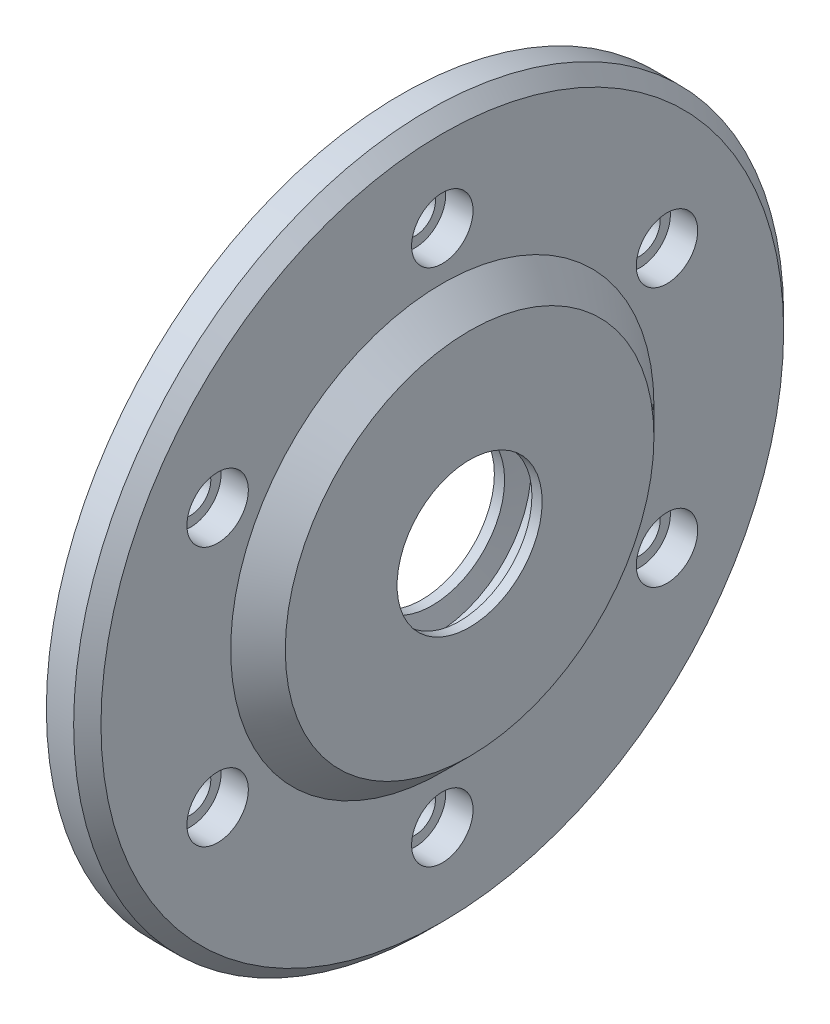
ISO-10303-21;
HEADER;
FILE_DESCRIPTION(('STEP AP214'),'2;1');
FILE_NAME('part.step','',(''),(''),'','','');
FILE_SCHEMA(('AUTOMOTIVE_DESIGN { 1 0 10303 214 1 1 1 1 }'));
ENDSEC;
DATA;
#1=APPLICATION_CONTEXT('core data for automotive mechanical design processes');
#2=APPLICATION_PROTOCOL_DEFINITION('international standard','automotive_design',2000,#1);
#3=PRODUCT_CONTEXT('',#1,'mechanical');
#4=PRODUCT('Part','Part','',(#3));
#5=PRODUCT_RELATED_PRODUCT_CATEGORY('part','',(#4));
#6=PRODUCT_DEFINITION_FORMATION('','',#4);
#7=PRODUCT_DEFINITION_CONTEXT('part definition',#1,'design');
#8=PRODUCT_DEFINITION('design','',#6,#7);
#9=PRODUCT_DEFINITION_SHAPE('','',#8);
#10=(LENGTH_UNIT() NAMED_UNIT(*) SI_UNIT(.MILLI.,.METRE.));
#11=(NAMED_UNIT(*) PLANE_ANGLE_UNIT() SI_UNIT($,.RADIAN.));
#12=(NAMED_UNIT(*) SI_UNIT($,.STERADIAN.) SOLID_ANGLE_UNIT());
#13=UNCERTAINTY_MEASURE_WITH_UNIT(LENGTH_MEASURE(1.E-05),#10,'distance_accuracy_value','');
#14=(GEOMETRIC_REPRESENTATION_CONTEXT(3) GLOBAL_UNCERTAINTY_ASSIGNED_CONTEXT((#13)) GLOBAL_UNIT_ASSIGNED_CONTEXT((#10,
#11,#12)) REPRESENTATION_CONTEXT('',''));
#15=CARTESIAN_POINT('',(0.,0.,0.));
#16=DIRECTION('',(0.,0.,1.));
#17=DIRECTION('',(1.,0.,0.));
#18=AXIS2_PLACEMENT_3D('',#15,#16,#17);
#19=CARTESIAN_POINT('',(0.,0.,0.));
#20=DIRECTION('',(1.,0.,0.));
#21=DIRECTION('',(0.,0.,-1.));
#22=AXIS2_PLACEMENT_3D('',#19,#20,#21);
#23=CYLINDRICAL_SURFACE('',#22,52.);
#24=CARTESIAN_POINT('',(3.9999999999996,0.,0.));
#25=DIRECTION('',(1.,0.,0.));
#26=DIRECTION('',(0.,0.,-1.));
#27=AXIS2_PLACEMENT_3D('',#24,#25,#26);
#28=CIRCLE('',#27,52.);
#29=CARTESIAN_POINT('',(3.9999999999996,0.,-52.));
#30=VERTEX_POINT('',#29);
#31=EDGE_CURVE('E10',#30,#30,#28,.F.);
#32=ORIENTED_EDGE('',*,*,#31,.T.);
#33=EDGE_LOOP('',(#32));
#34=FACE_BOUND('',#33,.T.);
#35=CARTESIAN_POINT('',(0.,0.,0.));
#36=DIRECTION('',(1.,0.,0.));
#37=DIRECTION('',(0.,0.,-1.));
#38=AXIS2_PLACEMENT_3D('',#35,#36,#37);
#39=CIRCLE('',#38,52.);
#40=CARTESIAN_POINT('',(0.,0.,-52.));
#41=VERTEX_POINT('',#40);
#42=EDGE_CURVE('E42',#41,#41,#39,.T.);
#43=ORIENTED_EDGE('',*,*,#42,.T.);
#44=EDGE_LOOP('',(#43));
#45=FACE_BOUND('',#44,.T.);
#46=ADVANCED_FACE('F31',(#34,#45),#23,.T.);
#47=CARTESIAN_POINT('',(0.,52.,0.));
#48=DIRECTION('',(-1.,0.,0.));
#49=DIRECTION('',(0.,0.,1.));
#50=AXIS2_PLACEMENT_3D('',#47,#48,#49);
#51=PLANE('',#50);
#52=CARTESIAN_POINT('',(0.,-19.,-32.9089653438087));
#53=DIRECTION('',(-1.,0.,0.));
#54=DIRECTION('',(0.,0.,1.));
#55=AXIS2_PLACEMENT_3D('',#52,#53,#54);
#56=CIRCLE('',#55,3.00000000000001);
#57=CARTESIAN_POINT('',(0.,-19.,-29.9089653438087));
#58=VERTEX_POINT('',#57);
#59=EDGE_CURVE('E49',#58,#58,#56,.T.);
#60=ORIENTED_EDGE('',*,*,#59,.F.);
#61=EDGE_LOOP('',(#60));
#62=FACE_BOUND('',#61,.T.);
#63=CARTESIAN_POINT('',(0.,-38.,0.));
#64=DIRECTION('',(-1.,0.,0.));
#65=DIRECTION('',(0.,0.,1.));
#66=AXIS2_PLACEMENT_3D('',#63,#64,#65);
#67=CIRCLE('',#66,3.00000000000002);
#68=CARTESIAN_POINT('',(0.,-38.,3.00000000000002));
#69=VERTEX_POINT('',#68);
#70=EDGE_CURVE('E54',#69,#69,#67,.T.);
#71=ORIENTED_EDGE('',*,*,#70,.F.);
#72=EDGE_LOOP('',(#71));
#73=FACE_BOUND('',#72,.T.);
#74=CARTESIAN_POINT('',(0.,-19.,32.9089653438087));
#75=DIRECTION('',(-1.,0.,0.));
#76=DIRECTION('',(0.,0.,1.));
#77=AXIS2_PLACEMENT_3D('',#74,#75,#76);
#78=CIRCLE('',#77,3.00000000000001);
#79=CARTESIAN_POINT('',(0.,-19.,35.9089653438087));
#80=VERTEX_POINT('',#79);
#81=EDGE_CURVE('E59',#80,#80,#78,.T.);
#82=ORIENTED_EDGE('',*,*,#81,.F.);
#83=EDGE_LOOP('',(#82));
#84=FACE_BOUND('',#83,.T.);
#85=CARTESIAN_POINT('',(0.,19.,32.9089653438087));
#86=DIRECTION('',(-1.,0.,0.));
#87=DIRECTION('',(0.,0.,1.));
#88=AXIS2_PLACEMENT_3D('',#85,#86,#87);
#89=CIRCLE('',#88,3.00000000000001);
#90=CARTESIAN_POINT('',(0.,19.,35.9089653438087));
#91=VERTEX_POINT('',#90);
#92=EDGE_CURVE('E64',#91,#91,#89,.T.);
#93=ORIENTED_EDGE('',*,*,#92,.F.);
#94=EDGE_LOOP('',(#93));
#95=FACE_BOUND('',#94,.T.);
#96=CARTESIAN_POINT('',(0.,38.,0.));
#97=DIRECTION('',(-1.,0.,0.));
#98=DIRECTION('',(0.,0.,1.));
#99=AXIS2_PLACEMENT_3D('',#96,#97,#98);
#100=CIRCLE('',#99,3.00000000000002);
#101=CARTESIAN_POINT('',(0.,38.,3.00000000000001));
#102=VERTEX_POINT('',#101);
#103=EDGE_CURVE('E69',#102,#102,#100,.T.);
#104=ORIENTED_EDGE('',*,*,#103,.F.);
#105=EDGE_LOOP('',(#104));
#106=FACE_BOUND('',#105,.T.);
#107=CARTESIAN_POINT('',(0.,19.,-32.9089653438087));
#108=DIRECTION('',(-1.,0.,0.));
#109=DIRECTION('',(0.,0.,1.));
#110=AXIS2_PLACEMENT_3D('',#107,#108,#109);
#111=CIRCLE('',#110,3.00000000000001);
#112=CARTESIAN_POINT('',(0.,19.,-29.9089653438087));
#113=VERTEX_POINT('',#112);
#114=EDGE_CURVE('E74',#113,#113,#111,.T.);
#115=ORIENTED_EDGE('',*,*,#114,.F.);
#116=EDGE_LOOP('',(#115));
#117=FACE_BOUND('',#116,.T.);
#118=CARTESIAN_POINT('',(0.,0.,0.));
#119=DIRECTION('',(-1.,0.,0.));
#120=DIRECTION('',(0.,0.,1.));
#121=AXIS2_PLACEMENT_3D('',#118,#119,#120);
#122=CIRCLE('',#121,33.);
#123=CARTESIAN_POINT('',(0.,0.,33.));
#124=VERTEX_POINT('',#123);
#125=EDGE_CURVE('E85',#124,#124,#122,.T.);
#126=ORIENTED_EDGE('',*,*,#125,.F.);
#127=EDGE_LOOP('',(#126));
#128=FACE_BOUND('',#127,.T.);
#129=ORIENTED_EDGE('',*,*,#42,.F.);
#130=EDGE_LOOP('',(#129));
#131=FACE_BOUND('',#130,.T.);
#132=ADVANCED_FACE('F169',(#62,#73,#84,#95,#106,#117,#128,#131),#51,.T.);
#133=CARTESIAN_POINT('',(6.,0.,0.));
#134=DIRECTION('',(1.,0.,0.));
#135=DIRECTION('',(0.,0.,-1.));
#136=AXIS2_PLACEMENT_3D('',#133,#134,#135);
#137=PLANE('',#136);
#138=CARTESIAN_POINT('',(6.,0.,0.));
#139=DIRECTION('',(1.,0.,0.));
#140=DIRECTION('',(0.,0.,-1.));
#141=AXIS2_PLACEMENT_3D('',#138,#139,#140);
#142=CIRCLE('',#141,49.9999999999996);
#143=CARTESIAN_POINT('',(6.,0.,-49.9999999999996));
#144=VERTEX_POINT('',#143);
#145=EDGE_CURVE('E38',#144,#144,#142,.T.);
#146=ORIENTED_EDGE('',*,*,#145,.T.);
#147=EDGE_LOOP('',(#146));
#148=FACE_BOUND('',#147,.T.);
#149=CARTESIAN_POINT('',(6.,-19.,-32.9089653438087));
#150=DIRECTION('',(1.,0.,0.));
#151=DIRECTION('',(0.,0.,-1.));
#152=AXIS2_PLACEMENT_3D('',#149,#150,#151);
#153=CIRCLE('',#152,4.50000000000001);
#154=CARTESIAN_POINT('',(6.,-19.,-37.4089653438087));
#155=VERTEX_POINT('',#154);
#156=EDGE_CURVE('E159',#155,#155,#153,.T.);
#157=ORIENTED_EDGE('',*,*,#156,.F.);
#158=EDGE_LOOP('',(#157));
#159=FACE_BOUND('',#158,.T.);
#160=CARTESIAN_POINT('',(6.,-38.,0.));
#161=DIRECTION('',(1.,0.,0.));
#162=DIRECTION('',(0.,0.,-1.));
#163=AXIS2_PLACEMENT_3D('',#160,#161,#162);
#164=CIRCLE('',#163,4.50000000000001);
#165=CARTESIAN_POINT('',(6.,-38.,-4.50000000000001));
#166=VERTEX_POINT('',#165);
#167=EDGE_CURVE('E52',#166,#166,#164,.T.);
#168=ORIENTED_EDGE('',*,*,#167,.F.);
#169=EDGE_LOOP('',(#168));
#170=FACE_BOUND('',#169,.T.);
#171=CARTESIAN_POINT('',(6.,-19.,32.9089653438087));
#172=DIRECTION('',(1.,0.,0.));
#173=DIRECTION('',(0.,0.,-1.));
#174=AXIS2_PLACEMENT_3D('',#171,#172,#173);
#175=CIRCLE('',#174,4.50000000000001);
#176=CARTESIAN_POINT('',(6.,-19.,28.4089653438087));
#177=VERTEX_POINT('',#176);
#178=EDGE_CURVE('E57',#177,#177,#175,.T.);
#179=ORIENTED_EDGE('',*,*,#178,.F.);
#180=EDGE_LOOP('',(#179));
#181=FACE_BOUND('',#180,.T.);
#182=CARTESIAN_POINT('',(6.,19.,32.9089653438087));
#183=DIRECTION('',(1.,0.,0.));
#184=DIRECTION('',(0.,0.,-1.));
#185=AXIS2_PLACEMENT_3D('',#182,#183,#184);
#186=CIRCLE('',#185,4.50000000000001);
#187=CARTESIAN_POINT('',(6.,19.,28.4089653438087));
#188=VERTEX_POINT('',#187);
#189=EDGE_CURVE('E62',#188,#188,#186,.T.);
#190=ORIENTED_EDGE('',*,*,#189,.F.);
#191=EDGE_LOOP('',(#190));
#192=FACE_BOUND('',#191,.T.);
#193=CARTESIAN_POINT('',(6.,38.,0.));
#194=DIRECTION('',(1.,0.,0.));
#195=DIRECTION('',(0.,0.,-1.));
#196=AXIS2_PLACEMENT_3D('',#193,#194,#195);
#197=CIRCLE('',#196,4.50000000000001);
#198=CARTESIAN_POINT('',(6.,38.,-4.50000000000002));
#199=VERTEX_POINT('',#198);
#200=EDGE_CURVE('E67',#199,#199,#197,.T.);
#201=ORIENTED_EDGE('',*,*,#200,.F.);
#202=EDGE_LOOP('',(#201));
#203=FACE_BOUND('',#202,.T.);
#204=CARTESIAN_POINT('',(6.,19.,-32.9089653438087));
#205=DIRECTION('',(1.,0.,0.));
#206=DIRECTION('',(0.,0.,-1.));
#207=AXIS2_PLACEMENT_3D('',#204,#205,#206);
#208=CIRCLE('',#207,4.50000000000001);
#209=CARTESIAN_POINT('',(6.,19.,-37.4089653438087));
#210=VERTEX_POINT('',#209);
#211=EDGE_CURVE('E72',#210,#210,#208,.T.);
#212=ORIENTED_EDGE('',*,*,#211,.F.);
#213=EDGE_LOOP('',(#212));
#214=FACE_BOUND('',#213,.T.);
#215=CARTESIAN_POINT('',(6.,0.,0.));
#216=DIRECTION('',(1.,0.,0.));
#217=DIRECTION('',(0.,0.,-1.));
#218=AXIS2_PLACEMENT_3D('',#215,#216,#217);
#219=CIRCLE('',#218,31.);
#220=CARTESIAN_POINT('',(6.,0.,-31.));
#221=VERTEX_POINT('',#220);
#222=EDGE_CURVE('E81',#221,#221,#219,.T.);
#223=ORIENTED_EDGE('',*,*,#222,.F.);
#224=EDGE_LOOP('',(#223));
#225=FACE_BOUND('',#224,.T.);
#226=ADVANCED_FACE('F165',(#148,#159,#170,#181,#192,#203,#214,#225),#137,.T.);
#227=CARTESIAN_POINT('',(6.,0.,0.));
#228=DIRECTION('',(-1.,0.,0.));
#229=DIRECTION('',(0.,0.,-1.));
#230=AXIS2_PLACEMENT_3D('',#227,#228,#229);
#231=CONICAL_SURFACE('',#230,31.,0.785398163397445);
#232=CARTESIAN_POINT('',(10.,0.,0.));
#233=DIRECTION('',(1.,0.,0.));
#234=DIRECTION('',(0.,0.,-1.));
#235=AXIS2_PLACEMENT_3D('',#232,#233,#234);
#236=CIRCLE('',#235,27.);
#237=CARTESIAN_POINT('',(10.,0.,-27.));
#238=VERTEX_POINT('',#237);
#239=EDGE_CURVE('E46',#238,#238,#236,.T.);
#240=ORIENTED_EDGE('',*,*,#239,.F.);
#241=EDGE_LOOP('',(#240));
#242=FACE_BOUND('',#241,.T.);
#243=ORIENTED_EDGE('',*,*,#222,.T.);
#244=EDGE_LOOP('',(#243));
#245=FACE_BOUND('',#244,.T.);
#246=ADVANCED_FACE('F168',(#242,#245),#231,.T.);
#247=CARTESIAN_POINT('',(10.,0.,0.));
#248=DIRECTION('',(1.,0.,0.));
#249=DIRECTION('',(0.,0.,-1.));
#250=AXIS2_PLACEMENT_3D('',#247,#248,#249);
#251=PLANE('',#250);
#252=CARTESIAN_POINT('',(10.,0.,0.));
#253=DIRECTION('',(1.,0.,0.));
#254=DIRECTION('',(0.,0.,-1.));
#255=AXIS2_PLACEMENT_3D('',#252,#253,#254);
#256=CIRCLE('',#255,10.6264091280305);
#257=CARTESIAN_POINT('',(10.,0.,-10.6264091280305));
#258=VERTEX_POINT('',#257);
#259=EDGE_CURVE('E93',#258,#258,#256,.T.);
#260=ORIENTED_EDGE('',*,*,#259,.F.);
#261=EDGE_LOOP('',(#260));
#262=FACE_BOUND('',#261,.T.);
#263=ORIENTED_EDGE('',*,*,#239,.T.);
#264=EDGE_LOOP('',(#263));
#265=FACE_BOUND('',#264,.T.);
#266=ADVANCED_FACE('F184',(#262,#265),#251,.T.);
#267=CARTESIAN_POINT('',(-1.,0.,0.));
#268=DIRECTION('',(1.,0.,0.));
#269=DIRECTION('',(0.,0.,-1.));
#270=AXIS2_PLACEMENT_3D('',#267,#268,#269);
#271=CYLINDRICAL_SURFACE('',#270,33.);
#272=CARTESIAN_POINT('',(-1.,0.,0.));
#273=DIRECTION('',(-1.,0.,0.));
#274=DIRECTION('',(0.,0.,1.));
#275=AXIS2_PLACEMENT_3D('',#272,#273,#274);
#276=CIRCLE('',#275,33.);
#277=CARTESIAN_POINT('',(-1.,0.,33.));
#278=VERTEX_POINT('',#277);
#279=EDGE_CURVE('E84',#278,#278,#276,.T.);
#280=ORIENTED_EDGE('',*,*,#279,.F.);
#281=EDGE_LOOP('',(#280));
#282=FACE_BOUND('',#281,.T.);
#283=ORIENTED_EDGE('',*,*,#125,.T.);
#284=EDGE_LOOP('',(#283));
#285=FACE_BOUND('',#284,.T.);
#286=ADVANCED_FACE('F190',(#282,#285),#271,.T.);
#287=CARTESIAN_POINT('',(-1.,0.,0.));
#288=DIRECTION('',(-1.,0.,0.));
#289=DIRECTION('',(0.,0.,1.));
#290=AXIS2_PLACEMENT_3D('',#287,#288,#289);
#291=PLANE('',#290);
#292=CARTESIAN_POINT('',(-1.,0.,0.));
#293=DIRECTION('',(1.,0.,0.));
#294=DIRECTION('',(0.,0.,-1.));
#295=AXIS2_PLACEMENT_3D('',#292,#293,#294);
#296=CIRCLE('',#295,25.);
#297=CARTESIAN_POINT('',(-1.,0.,-25.));
#298=VERTEX_POINT('',#297);
#299=EDGE_CURVE('E88',#298,#298,#296,.T.);
#300=ORIENTED_EDGE('',*,*,#299,.T.);
#301=EDGE_LOOP('',(#300));
#302=FACE_BOUND('',#301,.T.);
#303=ORIENTED_EDGE('',*,*,#279,.T.);
#304=EDGE_LOOP('',(#303));
#305=FACE_BOUND('',#304,.T.);
#306=ADVANCED_FACE('F220',(#302,#305),#291,.T.);
#307=CARTESIAN_POINT('',(-1.,0.,0.));
#308=DIRECTION('',(1.,0.,0.));
#309=DIRECTION('',(0.,0.,-1.));
#310=AXIS2_PLACEMENT_3D('',#307,#308,#309);
#311=CYLINDRICAL_SURFACE('',#310,25.);
#312=ORIENTED_EDGE('',*,*,#299,.F.);
#313=EDGE_LOOP('',(#312));
#314=FACE_BOUND('',#313,.T.);
#315=CARTESIAN_POINT('',(0.,0.,0.));
#316=DIRECTION('',(1.,0.,0.));
#317=DIRECTION('',(0.,0.,-1.));
#318=AXIS2_PLACEMENT_3D('',#315,#316,#317);
#319=CIRCLE('',#318,25.);
#320=CARTESIAN_POINT('',(0.,0.,-25.));
#321=VERTEX_POINT('',#320);
#322=EDGE_CURVE('E76',#321,#321,#319,.T.);
#323=ORIENTED_EDGE('',*,*,#322,.T.);
#324=EDGE_LOOP('',(#323));
#325=FACE_BOUND('',#324,.T.);
#326=ADVANCED_FACE('F226',(#314,#325),#311,.F.);
#327=CARTESIAN_POINT('',(-1.,0.,0.));
#328=DIRECTION('',(1.,0.,0.));
#329=DIRECTION('',(0.,0.,-1.));
#330=AXIS2_PLACEMENT_3D('',#327,#328,#329);
#331=CYLINDRICAL_SURFACE('',#330,10.6264091280305);
#332=CARTESIAN_POINT('',(8.5,0.,0.));
#333=DIRECTION('',(1.,0.,0.));
#334=DIRECTION('',(0.,0.,-1.));
#335=AXIS2_PLACEMENT_3D('',#332,#333,#334);
#336=CIRCLE('',#335,10.6264091280305);
#337=CARTESIAN_POINT('',(8.5,0.,-10.6264091280305));
#338=VERTEX_POINT('',#337);
#339=EDGE_CURVE('E96',#338,#338,#336,.T.);
#340=ORIENTED_EDGE('',*,*,#339,.F.);
#341=EDGE_LOOP('',(#340));
#342=FACE_BOUND('',#341,.T.);
#343=ORIENTED_EDGE('',*,*,#259,.T.);
#344=EDGE_LOOP('',(#343));
#345=FACE_BOUND('',#344,.T.);
#346=ADVANCED_FACE('F233',(#342,#345),#331,.F.);
#347=CARTESIAN_POINT('',(8.5,0.,0.));
#348=DIRECTION('',(-1.,0.,0.));
#349=DIRECTION('',(0.,0.,1.));
#350=AXIS2_PLACEMENT_3D('',#347,#348,#349);
#351=CONICAL_SURFACE('',#350,10.6264091280305,1.42365742036362);
#352=CARTESIAN_POINT('',(7.99999999999999,0.,0.));
#353=DIRECTION('',(1.,0.,0.));
#354=DIRECTION('',(0.,0.,-1.));
#355=AXIS2_PLACEMENT_3D('',#352,#353,#354);
#356=CIRCLE('',#355,14.);
#357=CARTESIAN_POINT('',(7.99999999999999,0.,-14.));
#358=VERTEX_POINT('',#357);
#359=EDGE_CURVE('E99',#358,#358,#356,.T.);
#360=ORIENTED_EDGE('',*,*,#359,.F.);
#361=EDGE_LOOP('',(#360));
#362=FACE_BOUND('',#361,.T.);
#363=ORIENTED_EDGE('',*,*,#339,.T.);
#364=EDGE_LOOP('',(#363));
#365=FACE_BOUND('',#364,.T.);
#366=ADVANCED_FACE('F237',(#362,#365),#351,.F.);
#367=CARTESIAN_POINT('',(-1.,0.,0.));
#368=DIRECTION('',(1.,0.,0.));
#369=DIRECTION('',(0.,0.,-1.));
#370=AXIS2_PLACEMENT_3D('',#367,#368,#369);
#371=CYLINDRICAL_SURFACE('',#370,14.);
#372=CARTESIAN_POINT('',(5.,0.,0.));
#373=DIRECTION('',(1.,0.,0.));
#374=DIRECTION('',(0.,0.,-1.));
#375=AXIS2_PLACEMENT_3D('',#372,#373,#374);
#376=CIRCLE('',#375,14.);
#377=CARTESIAN_POINT('',(5.,0.,-14.));
#378=VERTEX_POINT('',#377);
#379=EDGE_CURVE('E102',#378,#378,#376,.T.);
#380=ORIENTED_EDGE('',*,*,#379,.F.);
#381=EDGE_LOOP('',(#380));
#382=FACE_BOUND('',#381,.T.);
#383=ORIENTED_EDGE('',*,*,#359,.T.);
#384=EDGE_LOOP('',(#383));
#385=FACE_BOUND('',#384,.T.);
#386=ADVANCED_FACE('F241',(#382,#385),#371,.F.);
#387=CARTESIAN_POINT('',(5.,0.,0.));
#388=DIRECTION('',(1.,0.,0.));
#389=DIRECTION('',(0.,0.,-1.));
#390=AXIS2_PLACEMENT_3D('',#387,#388,#389);
#391=CONICAL_SURFACE('',#390,14.,1.42365742036362);
#392=CARTESIAN_POINT('',(4.5,0.,0.));
#393=DIRECTION('',(1.,0.,0.));
#394=DIRECTION('',(0.,0.,-1.));
#395=AXIS2_PLACEMENT_3D('',#392,#393,#394);
#396=CIRCLE('',#395,10.6264091280305);
#397=CARTESIAN_POINT('',(4.5,0.,-10.6264091280305));
#398=VERTEX_POINT('',#397);
#399=EDGE_CURVE('E105',#398,#398,#396,.T.);
#400=ORIENTED_EDGE('',*,*,#399,.F.);
#401=EDGE_LOOP('',(#400));
#402=FACE_BOUND('',#401,.T.);
#403=ORIENTED_EDGE('',*,*,#379,.T.);
#404=EDGE_LOOP('',(#403));
#405=FACE_BOUND('',#404,.T.);
#406=ADVANCED_FACE('F245',(#402,#405),#391,.F.);
#407=CARTESIAN_POINT('',(-1.,0.,0.));
#408=DIRECTION('',(1.,0.,0.));
#409=DIRECTION('',(0.,0.,-1.));
#410=AXIS2_PLACEMENT_3D('',#407,#408,#409);
#411=CYLINDRICAL_SURFACE('',#410,10.6264091280305);
#412=CARTESIAN_POINT('',(3.,0.,0.));
#413=DIRECTION('',(1.,0.,0.));
#414=DIRECTION('',(0.,0.,-1.));
#415=AXIS2_PLACEMENT_3D('',#412,#413,#414);
#416=CIRCLE('',#415,10.6264091280305);
#417=CARTESIAN_POINT('',(3.,0.,-10.6264091280305));
#418=VERTEX_POINT('',#417);
#419=EDGE_CURVE('E108',#418,#418,#416,.T.);
#420=ORIENTED_EDGE('',*,*,#419,.F.);
#421=EDGE_LOOP('',(#420));
#422=FACE_BOUND('',#421,.T.);
#423=ORIENTED_EDGE('',*,*,#399,.T.);
#424=EDGE_LOOP('',(#423));
#425=FACE_BOUND('',#424,.T.);
#426=ADVANCED_FACE('F249',(#422,#425),#411,.F.);
#427=CARTESIAN_POINT('',(3.,10.6264091280305,0.));
#428=DIRECTION('',(1.,0.,0.));
#429=DIRECTION('',(0.,0.,-1.));
#430=AXIS2_PLACEMENT_3D('',#427,#428,#429);
#431=PLANE('',#430);
#432=CARTESIAN_POINT('',(3.,0.,0.));
#433=DIRECTION('',(1.,0.,0.));
#434=DIRECTION('',(0.,0.,-1.));
#435=AXIS2_PLACEMENT_3D('',#432,#433,#434);
#436=CIRCLE('',#435,18.);
#437=CARTESIAN_POINT('',(3.,0.,-18.));
#438=VERTEX_POINT('',#437);
#439=EDGE_CURVE('E111',#438,#438,#436,.T.);
#440=ORIENTED_EDGE('',*,*,#439,.F.);
#441=EDGE_LOOP('',(#440));
#442=FACE_BOUND('',#441,.T.);
#443=ORIENTED_EDGE('',*,*,#419,.T.);
#444=EDGE_LOOP('',(#443));
#445=FACE_BOUND('',#444,.T.);
#446=ADVANCED_FACE('F253',(#442,#445),#431,.F.);
#447=CARTESIAN_POINT('',(-1.,0.,0.));
#448=DIRECTION('',(1.,0.,0.));
#449=DIRECTION('',(0.,0.,-1.));
#450=AXIS2_PLACEMENT_3D('',#447,#448,#449);
#451=CYLINDRICAL_SURFACE('',#450,18.);
#452=CARTESIAN_POINT('',(0.,0.,0.));
#453=DIRECTION('',(1.,0.,0.));
#454=DIRECTION('',(0.,0.,-1.));
#455=AXIS2_PLACEMENT_3D('',#452,#453,#454);
#456=CIRCLE('',#455,18.);
#457=CARTESIAN_POINT('',(0.,0.,-18.));
#458=VERTEX_POINT('',#457);
#459=EDGE_CURVE('E114',#458,#458,#456,.T.);
#460=ORIENTED_EDGE('',*,*,#459,.F.);
#461=EDGE_LOOP('',(#460));
#462=FACE_BOUND('',#461,.T.);
#463=ORIENTED_EDGE('',*,*,#439,.T.);
#464=EDGE_LOOP('',(#463));
#465=FACE_BOUND('',#464,.T.);
#466=ADVANCED_FACE('F257',(#462,#465),#451,.F.);
#467=CARTESIAN_POINT('',(0.,18.,0.));
#468=DIRECTION('',(1.,0.,0.));
#469=DIRECTION('',(0.,0.,-1.));
#470=AXIS2_PLACEMENT_3D('',#467,#468,#469);
#471=PLANE('',#470);
#472=ORIENTED_EDGE('',*,*,#322,.F.);
#473=EDGE_LOOP('',(#472));
#474=FACE_BOUND('',#473,.T.);
#475=ORIENTED_EDGE('',*,*,#459,.T.);
#476=EDGE_LOOP('',(#475));
#477=FACE_BOUND('',#476,.T.);
#478=ADVANCED_FACE('F261',(#474,#477),#471,.F.);
#479=CARTESIAN_POINT('',(6.,19.,-32.9089653438087));
#480=DIRECTION('',(1.,0.,0.));
#481=DIRECTION('',(0.,0.,-1.));
#482=AXIS2_PLACEMENT_3D('',#479,#480,#481);
#483=CYLINDRICAL_SURFACE('',#482,3.00000000000001);
#484=ORIENTED_EDGE('',*,*,#114,.T.);
#485=EDGE_LOOP('',(#484));
#486=FACE_BOUND('',#485,.T.);
#487=CARTESIAN_POINT('',(2.,19.,-32.9089653438087));
#488=DIRECTION('',(1.,0.,0.));
#489=DIRECTION('',(0.,0.,-1.));
#490=AXIS2_PLACEMENT_3D('',#487,#488,#489);
#491=CIRCLE('',#490,3.00000000000001);
#492=CARTESIAN_POINT('',(2.,19.,-35.9089653438087));
#493=VERTEX_POINT('',#492);
#494=EDGE_CURVE('E77',#493,#493,#491,.T.);
#495=ORIENTED_EDGE('',*,*,#494,.T.);
#496=EDGE_LOOP('',(#495));
#497=FACE_BOUND('',#496,.T.);
#498=ADVANCED_FACE('F265',(#486,#497),#483,.F.);
#499=CARTESIAN_POINT('',(2.,22.,-32.9089653438087));
#500=DIRECTION('',(-1.,0.,0.));
#501=DIRECTION('',(0.,0.,1.));
#502=AXIS2_PLACEMENT_3D('',#499,#500,#501);
#503=PLANE('',#502);
#504=ORIENTED_EDGE('',*,*,#494,.F.);
#505=EDGE_LOOP('',(#504));
#506=FACE_BOUND('',#505,.T.);
#507=CARTESIAN_POINT('',(2.,19.,-32.9089653438087));
#508=DIRECTION('',(1.,0.,0.));
#509=DIRECTION('',(0.,0.,-1.));
#510=AXIS2_PLACEMENT_3D('',#507,#508,#509);
#511=CIRCLE('',#510,4.50000000000001);
#512=CARTESIAN_POINT('',(2.,19.,-37.4089653438087));
#513=VERTEX_POINT('',#512);
#514=EDGE_CURVE('E121',#513,#513,#511,.T.);
#515=ORIENTED_EDGE('',*,*,#514,.T.);
#516=EDGE_LOOP('',(#515));
#517=FACE_BOUND('',#516,.T.);
#518=ADVANCED_FACE('F269',(#506,#517),#503,.F.);
#519=CARTESIAN_POINT('',(6.,19.,-32.9089653438087));
#520=DIRECTION('',(1.,0.,0.));
#521=DIRECTION('',(0.,0.,-1.));
#522=AXIS2_PLACEMENT_3D('',#519,#520,#521);
#523=CYLINDRICAL_SURFACE('',#522,4.50000000000001);
#524=ORIENTED_EDGE('',*,*,#514,.F.);
#525=EDGE_LOOP('',(#524));
#526=FACE_BOUND('',#525,.T.);
#527=ORIENTED_EDGE('',*,*,#211,.T.);
#528=EDGE_LOOP('',(#527));
#529=FACE_BOUND('',#528,.T.);
#530=ADVANCED_FACE('F273',(#526,#529),#523,.F.);
#531=CARTESIAN_POINT('',(6.,38.,0.));
#532=DIRECTION('',(1.,0.,0.));
#533=DIRECTION('',(0.,0.,-1.));
#534=AXIS2_PLACEMENT_3D('',#531,#532,#533);
#535=CYLINDRICAL_SURFACE('',#534,3.00000000000002);
#536=ORIENTED_EDGE('',*,*,#103,.T.);
#537=EDGE_LOOP('',(#536));
#538=FACE_BOUND('',#537,.T.);
#539=CARTESIAN_POINT('',(2.,38.,0.));
#540=DIRECTION('',(1.,0.,0.));
#541=DIRECTION('',(0.,0.,-1.));
#542=AXIS2_PLACEMENT_3D('',#539,#540,#541);
#543=CIRCLE('',#542,3.00000000000002);
#544=CARTESIAN_POINT('',(2.,38.,-3.00000000000002));
#545=VERTEX_POINT('',#544);
#546=EDGE_CURVE('E73',#545,#545,#543,.T.);
#547=ORIENTED_EDGE('',*,*,#546,.T.);
#548=EDGE_LOOP('',(#547));
#549=FACE_BOUND('',#548,.T.);
#550=ADVANCED_FACE('F277',(#538,#549),#535,.F.);
#551=CARTESIAN_POINT('',(2.,41.,0.));
#552=DIRECTION('',(-1.,0.,0.));
#553=DIRECTION('',(0.,0.,1.));
#554=AXIS2_PLACEMENT_3D('',#551,#552,#553);
#555=PLANE('',#554);
#556=ORIENTED_EDGE('',*,*,#546,.F.);
#557=EDGE_LOOP('',(#556));
#558=FACE_BOUND('',#557,.T.);
#559=CARTESIAN_POINT('',(2.,38.,0.));
#560=DIRECTION('',(1.,0.,0.));
#561=DIRECTION('',(0.,0.,-1.));
#562=AXIS2_PLACEMENT_3D('',#559,#560,#561);
#563=CIRCLE('',#562,4.50000000000001);
#564=CARTESIAN_POINT('',(2.,38.,-4.50000000000002));
#565=VERTEX_POINT('',#564);
#566=EDGE_CURVE('E128',#565,#565,#563,.T.);
#567=ORIENTED_EDGE('',*,*,#566,.T.);
#568=EDGE_LOOP('',(#567));
#569=FACE_BOUND('',#568,.T.);
#570=ADVANCED_FACE('F281',(#558,#569),#555,.F.);
#571=CARTESIAN_POINT('',(6.,38.,0.));
#572=DIRECTION('',(1.,0.,0.));
#573=DIRECTION('',(0.,0.,-1.));
#574=AXIS2_PLACEMENT_3D('',#571,#572,#573);
#575=CYLINDRICAL_SURFACE('',#574,4.50000000000001);
#576=ORIENTED_EDGE('',*,*,#566,.F.);
#577=EDGE_LOOP('',(#576));
#578=FACE_BOUND('',#577,.T.);
#579=ORIENTED_EDGE('',*,*,#200,.T.);
#580=EDGE_LOOP('',(#579));
#581=FACE_BOUND('',#580,.T.);
#582=ADVANCED_FACE('F285',(#578,#581),#575,.F.);
#583=CARTESIAN_POINT('',(6.,19.,32.9089653438087));
#584=DIRECTION('',(1.,0.,0.));
#585=DIRECTION('',(0.,0.,-1.));
#586=AXIS2_PLACEMENT_3D('',#583,#584,#585);
#587=CYLINDRICAL_SURFACE('',#586,3.00000000000001);
#588=ORIENTED_EDGE('',*,*,#92,.T.);
#589=EDGE_LOOP('',(#588));
#590=FACE_BOUND('',#589,.T.);
#591=CARTESIAN_POINT('',(2.,19.,32.9089653438087));
#592=DIRECTION('',(1.,0.,0.));
#593=DIRECTION('',(0.,0.,-1.));
#594=AXIS2_PLACEMENT_3D('',#591,#592,#593);
#595=CIRCLE('',#594,3.00000000000001);
#596=CARTESIAN_POINT('',(2.,19.,29.9089653438087));
#597=VERTEX_POINT('',#596);
#598=EDGE_CURVE('E68',#597,#597,#595,.T.);
#599=ORIENTED_EDGE('',*,*,#598,.T.);
#600=EDGE_LOOP('',(#599));
#601=FACE_BOUND('',#600,.T.);
#602=ADVANCED_FACE('F289',(#590,#601),#587,.F.);
#603=CARTESIAN_POINT('',(2.,22.,32.9089653438087));
#604=DIRECTION('',(-1.,0.,0.));
#605=DIRECTION('',(0.,0.,1.));
#606=AXIS2_PLACEMENT_3D('',#603,#604,#605);
#607=PLANE('',#606);
#608=ORIENTED_EDGE('',*,*,#598,.F.);
#609=EDGE_LOOP('',(#608));
#610=FACE_BOUND('',#609,.T.);
#611=CARTESIAN_POINT('',(2.,19.,32.9089653438087));
#612=DIRECTION('',(1.,0.,0.));
#613=DIRECTION('',(0.,0.,-1.));
#614=AXIS2_PLACEMENT_3D('',#611,#612,#613);
#615=CIRCLE('',#614,4.50000000000001);
#616=CARTESIAN_POINT('',(2.,19.,28.4089653438087));
#617=VERTEX_POINT('',#616);
#618=EDGE_CURVE('E135',#617,#617,#615,.T.);
#619=ORIENTED_EDGE('',*,*,#618,.T.);
#620=EDGE_LOOP('',(#619));
#621=FACE_BOUND('',#620,.T.);
#622=ADVANCED_FACE('F293',(#610,#621),#607,.F.);
#623=CARTESIAN_POINT('',(6.,19.,32.9089653438087));
#624=DIRECTION('',(1.,0.,0.));
#625=DIRECTION('',(0.,0.,-1.));
#626=AXIS2_PLACEMENT_3D('',#623,#624,#625);
#627=CYLINDRICAL_SURFACE('',#626,4.50000000000001);
#628=ORIENTED_EDGE('',*,*,#618,.F.);
#629=EDGE_LOOP('',(#628));
#630=FACE_BOUND('',#629,.T.);
#631=ORIENTED_EDGE('',*,*,#189,.T.);
#632=EDGE_LOOP('',(#631));
#633=FACE_BOUND('',#632,.T.);
#634=ADVANCED_FACE('F297',(#630,#633),#627,.F.);
#635=CARTESIAN_POINT('',(6.,-19.,32.9089653438087));
#636=DIRECTION('',(1.,0.,0.));
#637=DIRECTION('',(0.,0.,-1.));
#638=AXIS2_PLACEMENT_3D('',#635,#636,#637);
#639=CYLINDRICAL_SURFACE('',#638,3.00000000000001);
#640=ORIENTED_EDGE('',*,*,#81,.T.);
#641=EDGE_LOOP('',(#640));
#642=FACE_BOUND('',#641,.T.);
#643=CARTESIAN_POINT('',(2.,-19.,32.9089653438087));
#644=DIRECTION('',(1.,0.,0.));
#645=DIRECTION('',(0.,0.,-1.));
#646=AXIS2_PLACEMENT_3D('',#643,#644,#645);
#647=CIRCLE('',#646,3.00000000000001);
#648=CARTESIAN_POINT('',(2.,-19.,29.9089653438087));
#649=VERTEX_POINT('',#648);
#650=EDGE_CURVE('E63',#649,#649,#647,.T.);
#651=ORIENTED_EDGE('',*,*,#650,.T.);
#652=EDGE_LOOP('',(#651));
#653=FACE_BOUND('',#652,.T.);
#654=ADVANCED_FACE('F301',(#642,#653),#639,.F.);
#655=CARTESIAN_POINT('',(2.,-16.,32.9089653438087));
#656=DIRECTION('',(-1.,0.,0.));
#657=DIRECTION('',(0.,0.,1.));
#658=AXIS2_PLACEMENT_3D('',#655,#656,#657);
#659=PLANE('',#658);
#660=ORIENTED_EDGE('',*,*,#650,.F.);
#661=EDGE_LOOP('',(#660));
#662=FACE_BOUND('',#661,.T.);
#663=CARTESIAN_POINT('',(2.,-19.,32.9089653438087));
#664=DIRECTION('',(1.,0.,0.));
#665=DIRECTION('',(0.,0.,-1.));
#666=AXIS2_PLACEMENT_3D('',#663,#664,#665);
#667=CIRCLE('',#666,4.50000000000001);
#668=CARTESIAN_POINT('',(2.,-19.,28.4089653438087));
#669=VERTEX_POINT('',#668);
#670=EDGE_CURVE('E142',#669,#669,#667,.T.);
#671=ORIENTED_EDGE('',*,*,#670,.T.);
#672=EDGE_LOOP('',(#671));
#673=FACE_BOUND('',#672,.T.);
#674=ADVANCED_FACE('F305',(#662,#673),#659,.F.);
#675=CARTESIAN_POINT('',(6.,-19.,32.9089653438087));
#676=DIRECTION('',(1.,0.,0.));
#677=DIRECTION('',(0.,0.,-1.));
#678=AXIS2_PLACEMENT_3D('',#675,#676,#677);
#679=CYLINDRICAL_SURFACE('',#678,4.50000000000001);
#680=ORIENTED_EDGE('',*,*,#670,.F.);
#681=EDGE_LOOP('',(#680));
#682=FACE_BOUND('',#681,.T.);
#683=ORIENTED_EDGE('',*,*,#178,.T.);
#684=EDGE_LOOP('',(#683));
#685=FACE_BOUND('',#684,.T.);
#686=ADVANCED_FACE('F309',(#682,#685),#679,.F.);
#687=CARTESIAN_POINT('',(6.,-38.,0.));
#688=DIRECTION('',(1.,0.,0.));
#689=DIRECTION('',(0.,0.,-1.));
#690=AXIS2_PLACEMENT_3D('',#687,#688,#689);
#691=CYLINDRICAL_SURFACE('',#690,3.00000000000002);
#692=ORIENTED_EDGE('',*,*,#70,.T.);
#693=EDGE_LOOP('',(#692));
#694=FACE_BOUND('',#693,.T.);
#695=CARTESIAN_POINT('',(2.,-38.,0.));
#696=DIRECTION('',(1.,0.,0.));
#697=DIRECTION('',(0.,0.,-1.));
#698=AXIS2_PLACEMENT_3D('',#695,#696,#697);
#699=CIRCLE('',#698,3.00000000000002);
#700=CARTESIAN_POINT('',(2.,-38.,-3.00000000000001));
#701=VERTEX_POINT('',#700);
#702=EDGE_CURVE('E58',#701,#701,#699,.T.);
#703=ORIENTED_EDGE('',*,*,#702,.T.);
#704=EDGE_LOOP('',(#703));
#705=FACE_BOUND('',#704,.T.);
#706=ADVANCED_FACE('F313',(#694,#705),#691,.F.);
#707=CARTESIAN_POINT('',(2.,-35.,0.));
#708=DIRECTION('',(-1.,0.,0.));
#709=DIRECTION('',(0.,0.,1.));
#710=AXIS2_PLACEMENT_3D('',#707,#708,#709);
#711=PLANE('',#710);
#712=ORIENTED_EDGE('',*,*,#702,.F.);
#713=EDGE_LOOP('',(#712));
#714=FACE_BOUND('',#713,.T.);
#715=CARTESIAN_POINT('',(2.,-38.,0.));
#716=DIRECTION('',(1.,0.,0.));
#717=DIRECTION('',(0.,0.,-1.));
#718=AXIS2_PLACEMENT_3D('',#715,#716,#717);
#719=CIRCLE('',#718,4.50000000000001);
#720=CARTESIAN_POINT('',(2.,-38.,-4.50000000000001));
#721=VERTEX_POINT('',#720);
#722=EDGE_CURVE('E149',#721,#721,#719,.T.);
#723=ORIENTED_EDGE('',*,*,#722,.T.);
#724=EDGE_LOOP('',(#723));
#725=FACE_BOUND('',#724,.T.);
#726=ADVANCED_FACE('F317',(#714,#725),#711,.F.);
#727=CARTESIAN_POINT('',(6.,-38.,0.));
#728=DIRECTION('',(1.,0.,0.));
#729=DIRECTION('',(0.,0.,-1.));
#730=AXIS2_PLACEMENT_3D('',#727,#728,#729);
#731=CYLINDRICAL_SURFACE('',#730,4.50000000000001);
#732=ORIENTED_EDGE('',*,*,#722,.F.);
#733=EDGE_LOOP('',(#732));
#734=FACE_BOUND('',#733,.T.);
#735=ORIENTED_EDGE('',*,*,#167,.T.);
#736=EDGE_LOOP('',(#735));
#737=FACE_BOUND('',#736,.T.);
#738=ADVANCED_FACE('F321',(#734,#737),#731,.F.);
#739=CARTESIAN_POINT('',(6.,-19.,-32.9089653438087));
#740=DIRECTION('',(1.,0.,0.));
#741=DIRECTION('',(0.,0.,-1.));
#742=AXIS2_PLACEMENT_3D('',#739,#740,#741);
#743=CYLINDRICAL_SURFACE('',#742,3.00000000000001);
#744=ORIENTED_EDGE('',*,*,#59,.T.);
#745=EDGE_LOOP('',(#744));
#746=FACE_BOUND('',#745,.T.);
#747=CARTESIAN_POINT('',(2.,-19.,-32.9089653438087));
#748=DIRECTION('',(1.,0.,0.));
#749=DIRECTION('',(0.,0.,-1.));
#750=AXIS2_PLACEMENT_3D('',#747,#748,#749);
#751=CIRCLE('',#750,3.00000000000001);
#752=CARTESIAN_POINT('',(2.,-19.,-35.9089653438087));
#753=VERTEX_POINT('',#752);
#754=EDGE_CURVE('E53',#753,#753,#751,.T.);
#755=ORIENTED_EDGE('',*,*,#754,.T.);
#756=EDGE_LOOP('',(#755));
#757=FACE_BOUND('',#756,.T.);
#758=ADVANCED_FACE('F325',(#746,#757),#743,.F.);
#759=CARTESIAN_POINT('',(2.,-16.,-32.9089653438087));
#760=DIRECTION('',(-1.,0.,0.));
#761=DIRECTION('',(0.,0.,1.));
#762=AXIS2_PLACEMENT_3D('',#759,#760,#761);
#763=PLANE('',#762);
#764=ORIENTED_EDGE('',*,*,#754,.F.);
#765=EDGE_LOOP('',(#764));
#766=FACE_BOUND('',#765,.T.);
#767=CARTESIAN_POINT('',(2.,-19.,-32.9089653438087));
#768=DIRECTION('',(1.,0.,0.));
#769=DIRECTION('',(0.,0.,-1.));
#770=AXIS2_PLACEMENT_3D('',#767,#768,#769);
#771=CIRCLE('',#770,4.50000000000001);
#772=CARTESIAN_POINT('',(2.,-19.,-37.4089653438087));
#773=VERTEX_POINT('',#772);
#774=EDGE_CURVE('E156',#773,#773,#771,.T.);
#775=ORIENTED_EDGE('',*,*,#774,.T.);
#776=EDGE_LOOP('',(#775));
#777=FACE_BOUND('',#776,.T.);
#778=ADVANCED_FACE('F329',(#766,#777),#763,.F.);
#779=CARTESIAN_POINT('',(6.,-19.,-32.9089653438087));
#780=DIRECTION('',(1.,0.,0.));
#781=DIRECTION('',(0.,0.,-1.));
#782=AXIS2_PLACEMENT_3D('',#779,#780,#781);
#783=CYLINDRICAL_SURFACE('',#782,4.50000000000001);
#784=ORIENTED_EDGE('',*,*,#774,.F.);
#785=EDGE_LOOP('',(#784));
#786=FACE_BOUND('',#785,.T.);
#787=ORIENTED_EDGE('',*,*,#156,.T.);
#788=EDGE_LOOP('',(#787));
#789=FACE_BOUND('',#788,.T.);
#790=ADVANCED_FACE('F163',(#786,#789),#783,.F.);
#791=CARTESIAN_POINT('',(6.,0.,0.));
#792=DIRECTION('',(-1.,0.,0.));
#793=DIRECTION('',(0.,0.,1.));
#794=AXIS2_PLACEMENT_3D('',#791,#792,#793);
#795=CONICAL_SURFACE('',#794,49.9999999999996,0.785398163397445);
#796=ORIENTED_EDGE('',*,*,#31,.F.);
#797=EDGE_LOOP('',(#796));
#798=FACE_BOUND('',#797,.T.);
#799=ORIENTED_EDGE('',*,*,#145,.F.);
#800=EDGE_LOOP('',(#799));
#801=FACE_BOUND('',#800,.T.);
#802=ADVANCED_FACE('F33',(#798,#801),#795,.T.);
#803=CLOSED_SHELL('',(#46,#132,#226,#246,#266,#286,#306,#326,#346,#366,#386,#406,#426,#446,#466,
#478,#498,#518,#530,#550,#570,#582,#602,#622,#634,#654,#674,#686,#706,#726,#738,#758,#778,#790,#802));
#804=MANIFOLD_SOLID_BREP('B2',#803);
#805=ADVANCED_BREP_SHAPE_REPRESENTATION('',(#18,#804),#14);
#806=SHAPE_DEFINITION_REPRESENTATION(#9,#805);
ENDSEC;
END-ISO-10303-21;
